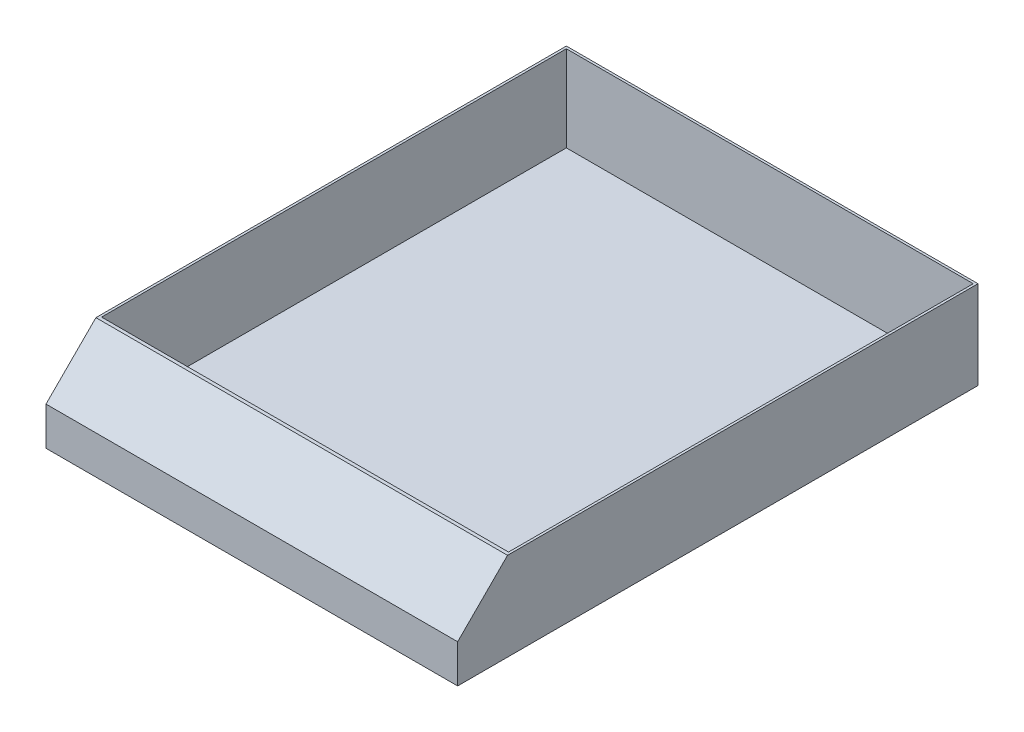
ISO-10303-21;
HEADER;
FILE_DESCRIPTION(('STEP AP214'),'2;1');
FILE_NAME('part.step','',(''),(''),'','','');
FILE_SCHEMA(('AUTOMOTIVE_DESIGN { 1 0 10303 214 1 1 1 1 }'));
ENDSEC;
DATA;
#1=APPLICATION_CONTEXT('core data for automotive mechanical design processes');
#2=APPLICATION_PROTOCOL_DEFINITION('international standard','automotive_design',2000,#1);
#3=PRODUCT_CONTEXT('',#1,'mechanical');
#4=PRODUCT('Part','Part','',(#3));
#5=PRODUCT_RELATED_PRODUCT_CATEGORY('part','',(#4));
#6=PRODUCT_DEFINITION_FORMATION('','',#4);
#7=PRODUCT_DEFINITION_CONTEXT('part definition',#1,'design');
#8=PRODUCT_DEFINITION('design','',#6,#7);
#9=PRODUCT_DEFINITION_SHAPE('','',#8);
#10=(LENGTH_UNIT() NAMED_UNIT(*) SI_UNIT(.MILLI.,.METRE.));
#11=(NAMED_UNIT(*) PLANE_ANGLE_UNIT() SI_UNIT($,.RADIAN.));
#12=(NAMED_UNIT(*) SI_UNIT($,.STERADIAN.) SOLID_ANGLE_UNIT());
#13=UNCERTAINTY_MEASURE_WITH_UNIT(LENGTH_MEASURE(1.E-05),#10,'distance_accuracy_value','');
#14=(GEOMETRIC_REPRESENTATION_CONTEXT(3) GLOBAL_UNCERTAINTY_ASSIGNED_CONTEXT((#13)) GLOBAL_UNIT_ASSIGNED_CONTEXT((#10,
#11,#12)) REPRESENTATION_CONTEXT('',''));
#15=CARTESIAN_POINT('',(0.,0.,0.));
#16=DIRECTION('',(0.,0.,1.));
#17=DIRECTION('',(1.,0.,0.));
#18=AXIS2_PLACEMENT_3D('',#15,#16,#17);
#19=CARTESIAN_POINT('',(700.,150.,-84.8528137423858));
#20=DIRECTION('',(0.,-1.,0.));
#21=DIRECTION('',(0.,0.,-1.));
#22=AXIS2_PLACEMENT_3D('',#19,#20,#21);
#23=PLANE('',#22);
#24=DIRECTION('',(0.,0.,1.));
#25=VECTOR('',#24,1.);
#26=CARTESIAN_POINT('',(0.,150.,-84.8528137423858));
#27=LINE('',#26,#25);
#28=CARTESIAN_POINT('',(0.,150.,-884.852813742386));
#29=VERTEX_POINT('',#28);
#30=CARTESIAN_POINT('',(0.,150.,-84.8528137423858));
#31=VERTEX_POINT('',#30);
#32=EDGE_CURVE('E115',#29,#31,#27,.T.);
#33=ORIENTED_EDGE('',*,*,#32,.T.);
#34=DIRECTION('',(-1.,0.,0.));
#35=VECTOR('',#34,1.);
#36=CARTESIAN_POINT('',(700.,150.,-84.8528137423858));
#37=LINE('',#36,#35);
#38=CARTESIAN_POINT('',(700.,150.,-84.8528137423858));
#39=VERTEX_POINT('',#38);
#40=EDGE_CURVE('E112',#39,#31,#37,.T.);
#41=ORIENTED_EDGE('',*,*,#40,.F.);
#42=DIRECTION('',(0.,0.,1.));
#43=VECTOR('',#42,1.);
#44=CARTESIAN_POINT('',(700.,150.,-84.8528137423858));
#45=LINE('',#44,#43);
#46=CARTESIAN_POINT('',(700.,150.,-884.852813742386));
#47=VERTEX_POINT('',#46);
#48=EDGE_CURVE('E102',#47,#39,#45,.T.);
#49=ORIENTED_EDGE('',*,*,#48,.F.);
#50=DIRECTION('',(-1.,0.,0.));
#51=VECTOR('',#50,1.);
#52=CARTESIAN_POINT('',(700.,150.,-884.852813742386));
#53=LINE('',#52,#51);
#54=EDGE_CURVE('E47',#47,#29,#53,.T.);
#55=ORIENTED_EDGE('',*,*,#54,.T.);
#56=EDGE_LOOP('',(#33,#41,#49,#55));
#57=FACE_BOUND('',#56,.T.);
#58=DIRECTION('',(0.,0.,1.));
#59=VECTOR('',#58,1.);
#60=CARTESIAN_POINT('',(4.,150.,0.));
#61=LINE('',#60,#59);
#62=CARTESIAN_POINT('',(4.,150.,-880.852813742386));
#63=VERTEX_POINT('',#62);
#64=CARTESIAN_POINT('',(4.,150.,-90.5096679918782));
#65=VERTEX_POINT('',#64);
#66=EDGE_CURVE('E155',#63,#65,#61,.T.);
#67=ORIENTED_EDGE('',*,*,#66,.F.);
#68=DIRECTION('',(-1.,0.,0.));
#69=VECTOR('',#68,1.);
#70=CARTESIAN_POINT('',(700.,150.,-880.852813742386));
#71=LINE('',#70,#69);
#72=CARTESIAN_POINT('',(696.,150.,-880.852813742386));
#73=VERTEX_POINT('',#72);
#74=EDGE_CURVE('E153',#73,#63,#71,.T.);
#75=ORIENTED_EDGE('',*,*,#74,.F.);
#76=DIRECTION('',(0.,0.,1.));
#77=VECTOR('',#76,1.);
#78=CARTESIAN_POINT('',(696.,150.,0.));
#79=LINE('',#78,#77);
#80=CARTESIAN_POINT('',(696.,150.,-90.5096679918782));
#81=VERTEX_POINT('',#80);
#82=EDGE_CURVE('E54',#73,#81,#79,.T.);
#83=ORIENTED_EDGE('',*,*,#82,.T.);
#84=DIRECTION('',(-1.,0.,0.));
#85=VECTOR('',#84,1.);
#86=CARTESIAN_POINT('',(700.,150.,-90.5096679918782));
#87=LINE('',#86,#85);
#88=EDGE_CURVE('E150',#81,#65,#87,.T.);
#89=ORIENTED_EDGE('',*,*,#88,.T.);
#90=EDGE_LOOP('',(#67,#75,#83,#89));
#91=FACE_BOUND('',#90,.T.);
#92=ADVANCED_FACE('F39',(#57,#91),#23,.F.);
#93=CARTESIAN_POINT('',(700.,1.09195334951539E-13,-884.852813742386));
#94=DIRECTION('',(0.,1.,0.));
#95=DIRECTION('',(0.,0.,1.));
#96=AXIS2_PLACEMENT_3D('',#93,#94,#95);
#97=PLANE('',#96);
#98=DIRECTION('',(0.,0.,-1.));
#99=VECTOR('',#98,1.);
#100=CARTESIAN_POINT('',(0.,1.09195334951539E-13,-884.852813742386));
#101=LINE('',#100,#99);
#102=CARTESIAN_POINT('',(0.,0.,0.));
#103=VERTEX_POINT('',#102);
#104=CARTESIAN_POINT('',(0.,1.09195334951539E-13,-884.852813742386));
#105=VERTEX_POINT('',#104);
#106=EDGE_CURVE('E126',#103,#105,#101,.T.);
#107=ORIENTED_EDGE('',*,*,#106,.T.);
#108=DIRECTION('',(-1.,0.,0.));
#109=VECTOR('',#108,1.);
#110=CARTESIAN_POINT('',(700.,1.09195334951539E-13,-884.852813742386));
#111=LINE('',#110,#109);
#112=CARTESIAN_POINT('',(700.,1.09195334951539E-13,-884.852813742386));
#113=VERTEX_POINT('',#112);
#114=EDGE_CURVE('E11',#113,#105,#111,.T.);
#115=ORIENTED_EDGE('',*,*,#114,.F.);
#116=DIRECTION('',(0.,0.,-1.));
#117=VECTOR('',#116,1.);
#118=CARTESIAN_POINT('',(700.,1.09195334951539E-13,-884.852813742386));
#119=LINE('',#118,#117);
#120=CARTESIAN_POINT('',(700.,0.,0.));
#121=VERTEX_POINT('',#120);
#122=EDGE_CURVE('E136',#121,#113,#119,.T.);
#123=ORIENTED_EDGE('',*,*,#122,.F.);
#124=DIRECTION('',(-1.,0.,0.));
#125=VECTOR('',#124,1.);
#126=CARTESIAN_POINT('',(700.,0.,0.));
#127=LINE('',#126,#125);
#128=EDGE_CURVE('E122',#121,#103,#127,.T.);
#129=ORIENTED_EDGE('',*,*,#128,.T.);
#130=EDGE_LOOP('',(#107,#115,#123,#129));
#131=FACE_BOUND('',#130,.T.);
#132=ADVANCED_FACE('F41',(#131),#97,.F.);
#133=CARTESIAN_POINT('',(700.,150.,-884.852813742386));
#134=DIRECTION('',(0.,0.,1.));
#135=DIRECTION('',(1.,0.,0.));
#136=AXIS2_PLACEMENT_3D('',#133,#134,#135);
#137=PLANE('',#136);
#138=DIRECTION('',(0.,1.,0.));
#139=VECTOR('',#138,1.);
#140=CARTESIAN_POINT('',(0.,150.,-884.852813742386));
#141=LINE('',#140,#139);
#142=EDGE_CURVE('E129',#105,#29,#141,.T.);
#143=ORIENTED_EDGE('',*,*,#142,.T.);
#144=ORIENTED_EDGE('',*,*,#54,.F.);
#145=DIRECTION('',(0.,1.,0.));
#146=VECTOR('',#145,1.);
#147=CARTESIAN_POINT('',(700.,150.,-884.852813742386));
#148=LINE('',#147,#146);
#149=EDGE_CURVE('E95',#113,#47,#148,.T.);
#150=ORIENTED_EDGE('',*,*,#149,.F.);
#151=ORIENTED_EDGE('',*,*,#114,.T.);
#152=EDGE_LOOP('',(#143,#144,#150,#151));
#153=FACE_BOUND('',#152,.T.);
#154=ADVANCED_FACE('F237',(#153),#137,.F.);
#155=CARTESIAN_POINT('',(700.,65.1471862576146,0.));
#156=DIRECTION('',(0.,-0.707106781186549,-0.707106781186546));
#157=DIRECTION('',(0.,0.707106781186546,-0.707106781186549));
#158=AXIS2_PLACEMENT_3D('',#155,#156,#157);
#159=PLANE('',#158);
#160=DIRECTION('',(0.,-0.707106781186546,0.707106781186549));
#161=VECTOR('',#160,1.);
#162=CARTESIAN_POINT('',(0.,65.1471862576146,0.));
#163=LINE('',#162,#161);
#164=CARTESIAN_POINT('',(0.,65.1471862576146,0.));
#165=VERTEX_POINT('',#164);
#166=EDGE_CURVE('E133',#31,#165,#163,.T.);
#167=ORIENTED_EDGE('',*,*,#166,.T.);
#168=DIRECTION('',(-1.,0.,0.));
#169=VECTOR('',#168,1.);
#170=CARTESIAN_POINT('',(700.,65.1471862576146,0.));
#171=LINE('',#170,#169);
#172=CARTESIAN_POINT('',(700.,65.1471862576146,0.));
#173=VERTEX_POINT('',#172);
#174=EDGE_CURVE('E118',#173,#165,#171,.T.);
#175=ORIENTED_EDGE('',*,*,#174,.F.);
#176=DIRECTION('',(0.,-0.707106781186546,0.707106781186549));
#177=VECTOR('',#176,1.);
#178=CARTESIAN_POINT('',(700.,65.1471862576146,0.));
#179=LINE('',#178,#177);
#180=EDGE_CURVE('E106',#39,#173,#179,.T.);
#181=ORIENTED_EDGE('',*,*,#180,.F.);
#182=ORIENTED_EDGE('',*,*,#40,.T.);
#183=EDGE_LOOP('',(#167,#175,#181,#182));
#184=FACE_BOUND('',#183,.T.);
#185=ADVANCED_FACE('F120',(#184),#159,.F.);
#186=CARTESIAN_POINT('',(700.,0.,0.));
#187=DIRECTION('',(0.,0.,-1.));
#188=DIRECTION('',(0.,1.,0.));
#189=AXIS2_PLACEMENT_3D('',#186,#187,#188);
#190=PLANE('',#189);
#191=DIRECTION('',(0.,-1.,0.));
#192=VECTOR('',#191,1.);
#193=CARTESIAN_POINT('',(0.,0.,0.));
#194=LINE('',#193,#192);
#195=EDGE_CURVE('E87',#165,#103,#194,.T.);
#196=ORIENTED_EDGE('',*,*,#195,.T.);
#197=ORIENTED_EDGE('',*,*,#128,.F.);
#198=DIRECTION('',(0.,-1.,0.));
#199=VECTOR('',#198,1.);
#200=CARTESIAN_POINT('',(700.,0.,0.));
#201=LINE('',#200,#199);
#202=EDGE_CURVE('E63',#173,#121,#201,.T.);
#203=ORIENTED_EDGE('',*,*,#202,.F.);
#204=ORIENTED_EDGE('',*,*,#174,.T.);
#205=EDGE_LOOP('',(#196,#197,#203,#204));
#206=FACE_BOUND('',#205,.T.);
#207=ADVANCED_FACE('F141',(#206),#190,.F.);
#208=CARTESIAN_POINT('',(700.,0.,0.));
#209=DIRECTION('',(-1.,0.,0.));
#210=DIRECTION('',(0.,0.,1.));
#211=AXIS2_PLACEMENT_3D('',#208,#209,#210);
#212=PLANE('',#211);
#213=ORIENTED_EDGE('',*,*,#122,.T.);
#214=ORIENTED_EDGE('',*,*,#149,.T.);
#215=ORIENTED_EDGE('',*,*,#48,.T.);
#216=ORIENTED_EDGE('',*,*,#180,.T.);
#217=ORIENTED_EDGE('',*,*,#202,.T.);
#218=EDGE_LOOP('',(#213,#214,#215,#216,#217));
#219=FACE_BOUND('',#218,.T.);
#220=ADVANCED_FACE('F104',(#219),#212,.F.);
#221=CARTESIAN_POINT('',(0.,0.,0.));
#222=DIRECTION('',(-1.,0.,0.));
#223=DIRECTION('',(0.,0.,1.));
#224=AXIS2_PLACEMENT_3D('',#221,#222,#223);
#225=PLANE('',#224);
#226=ORIENTED_EDGE('',*,*,#106,.F.);
#227=ORIENTED_EDGE('',*,*,#195,.F.);
#228=ORIENTED_EDGE('',*,*,#166,.F.);
#229=ORIENTED_EDGE('',*,*,#32,.F.);
#230=ORIENTED_EDGE('',*,*,#142,.F.);
#231=EDGE_LOOP('',(#226,#227,#228,#229,#230));
#232=FACE_BOUND('',#231,.T.);
#233=ADVANCED_FACE('F140',(#232),#225,.T.);
#234=CARTESIAN_POINT('',(700.,4.00000000000011,-884.852813742386));
#235=DIRECTION('',(0.,1.,0.));
#236=DIRECTION('',(0.,0.,1.));
#237=AXIS2_PLACEMENT_3D('',#234,#235,#236);
#238=PLANE('',#237);
#239=DIRECTION('',(0.,0.,-1.));
#240=VECTOR('',#239,1.);
#241=CARTESIAN_POINT('',(4.,4.,0.));
#242=LINE('',#241,#240);
#243=CARTESIAN_POINT('',(4.,4.,-4.));
#244=VERTEX_POINT('',#243);
#245=CARTESIAN_POINT('',(4.,4.00000000000011,-880.852813742386));
#246=VERTEX_POINT('',#245);
#247=EDGE_CURVE('E179',#244,#246,#242,.T.);
#248=ORIENTED_EDGE('',*,*,#247,.F.);
#249=DIRECTION('',(-1.,0.,0.));
#250=VECTOR('',#249,1.);
#251=CARTESIAN_POINT('',(700.,4.,-4.));
#252=LINE('',#251,#250);
#253=CARTESIAN_POINT('',(696.,4.,-4.));
#254=VERTEX_POINT('',#253);
#255=EDGE_CURVE('E168',#254,#244,#252,.T.);
#256=ORIENTED_EDGE('',*,*,#255,.F.);
#257=DIRECTION('',(0.,0.,-1.));
#258=VECTOR('',#257,1.);
#259=CARTESIAN_POINT('',(696.,4.,0.));
#260=LINE('',#259,#258);
#261=CARTESIAN_POINT('',(696.,4.00000000000011,-880.852813742386));
#262=VERTEX_POINT('',#261);
#263=EDGE_CURVE('E165',#254,#262,#260,.T.);
#264=ORIENTED_EDGE('',*,*,#263,.T.);
#265=DIRECTION('',(-1.,0.,0.));
#266=VECTOR('',#265,1.);
#267=CARTESIAN_POINT('',(700.,4.00000000000011,-880.852813742386));
#268=LINE('',#267,#266);
#269=EDGE_CURVE('E130',#262,#246,#268,.T.);
#270=ORIENTED_EDGE('',*,*,#269,.T.);
#271=EDGE_LOOP('',(#248,#256,#264,#270));
#272=FACE_BOUND('',#271,.T.);
#273=ADVANCED_FACE('F198',(#272),#238,.T.);
#274=CARTESIAN_POINT('',(700.,150.,-880.852813742386));
#275=DIRECTION('',(0.,0.,1.));
#276=DIRECTION('',(1.,0.,0.));
#277=AXIS2_PLACEMENT_3D('',#274,#275,#276);
#278=PLANE('',#277);
#279=DIRECTION('',(0.,1.,0.));
#280=VECTOR('',#279,1.);
#281=CARTESIAN_POINT('',(4.,0.,-880.852813742386));
#282=LINE('',#281,#280);
#283=EDGE_CURVE('E159',#246,#63,#282,.T.);
#284=ORIENTED_EDGE('',*,*,#283,.F.);
#285=ORIENTED_EDGE('',*,*,#269,.F.);
#286=DIRECTION('',(0.,1.,0.));
#287=VECTOR('',#286,1.);
#288=CARTESIAN_POINT('',(696.,0.,-880.852813742386));
#289=LINE('',#288,#287);
#290=EDGE_CURVE('E149',#262,#73,#289,.T.);
#291=ORIENTED_EDGE('',*,*,#290,.T.);
#292=ORIENTED_EDGE('',*,*,#74,.T.);
#293=EDGE_LOOP('',(#284,#285,#291,#292));
#294=FACE_BOUND('',#293,.T.);
#295=ADVANCED_FACE('F223',(#294),#278,.T.);
#296=CARTESIAN_POINT('',(700.,62.3187591328684,-2.82842712474616));
#297=DIRECTION('',(0.,-0.707106781186549,-0.707106781186546));
#298=DIRECTION('',(0.,0.707106781186546,-0.707106781186549));
#299=AXIS2_PLACEMENT_3D('',#296,#297,#298);
#300=PLANE('',#299);
#301=DIRECTION('',(0.,-0.707106781186546,0.707106781186549));
#302=VECTOR('',#301,1.);
#303=CARTESIAN_POINT('',(4.,29.7451660040612,29.7451660040611));
#304=LINE('',#303,#302);
#305=CARTESIAN_POINT('',(4.,63.4903320081222,-3.99999999999997));
#306=VERTEX_POINT('',#305);
#307=EDGE_CURVE('E158',#65,#306,#304,.T.);
#308=ORIENTED_EDGE('',*,*,#307,.F.);
#309=ORIENTED_EDGE('',*,*,#88,.F.);
#310=DIRECTION('',(0.,-0.707106781186546,0.707106781186549));
#311=VECTOR('',#310,1.);
#312=CARTESIAN_POINT('',(696.,29.7451660040612,29.7451660040611));
#313=LINE('',#312,#311);
#314=CARTESIAN_POINT('',(696.,63.4903320081222,-3.99999999999997));
#315=VERTEX_POINT('',#314);
#316=EDGE_CURVE('E148',#81,#315,#313,.T.);
#317=ORIENTED_EDGE('',*,*,#316,.T.);
#318=DIRECTION('',(-1.,0.,0.));
#319=VECTOR('',#318,1.);
#320=CARTESIAN_POINT('',(700.,63.4903320081222,-3.99999999999997));
#321=LINE('',#320,#319);
#322=EDGE_CURVE('E154',#315,#306,#321,.T.);
#323=ORIENTED_EDGE('',*,*,#322,.T.);
#324=EDGE_LOOP('',(#308,#309,#317,#323));
#325=FACE_BOUND('',#324,.T.);
#326=ADVANCED_FACE('F214',(#325),#300,.T.);
#327=CARTESIAN_POINT('',(700.,0.,-4.));
#328=DIRECTION('',(0.,0.,-1.));
#329=DIRECTION('',(0.,1.,0.));
#330=AXIS2_PLACEMENT_3D('',#327,#328,#329);
#331=PLANE('',#330);
#332=DIRECTION('',(0.,-1.,0.));
#333=VECTOR('',#332,1.);
#334=CARTESIAN_POINT('',(4.,0.,-4.));
#335=LINE('',#334,#333);
#336=EDGE_CURVE('E162',#306,#244,#335,.T.);
#337=ORIENTED_EDGE('',*,*,#336,.F.);
#338=ORIENTED_EDGE('',*,*,#322,.F.);
#339=DIRECTION('',(0.,-1.,0.));
#340=VECTOR('',#339,1.);
#341=CARTESIAN_POINT('',(696.,0.,-4.));
#342=LINE('',#341,#340);
#343=EDGE_CURVE('E171',#315,#254,#342,.T.);
#344=ORIENTED_EDGE('',*,*,#343,.T.);
#345=ORIENTED_EDGE('',*,*,#255,.T.);
#346=EDGE_LOOP('',(#337,#338,#344,#345));
#347=FACE_BOUND('',#346,.T.);
#348=ADVANCED_FACE('F220',(#347),#331,.T.);
#349=CARTESIAN_POINT('',(696.,0.,0.));
#350=DIRECTION('',(-1.,0.,0.));
#351=DIRECTION('',(0.,0.,1.));
#352=AXIS2_PLACEMENT_3D('',#349,#350,#351);
#353=PLANE('',#352);
#354=ORIENTED_EDGE('',*,*,#263,.F.);
#355=ORIENTED_EDGE('',*,*,#343,.F.);
#356=ORIENTED_EDGE('',*,*,#316,.F.);
#357=ORIENTED_EDGE('',*,*,#82,.F.);
#358=ORIENTED_EDGE('',*,*,#290,.F.);
#359=EDGE_LOOP('',(#354,#355,#356,#357,#358));
#360=FACE_BOUND('',#359,.T.);
#361=ADVANCED_FACE('F221',(#360),#353,.T.);
#362=CARTESIAN_POINT('',(4.,0.,0.));
#363=DIRECTION('',(-1.,0.,0.));
#364=DIRECTION('',(0.,0.,1.));
#365=AXIS2_PLACEMENT_3D('',#362,#363,#364);
#366=PLANE('',#365);
#367=ORIENTED_EDGE('',*,*,#247,.T.);
#368=ORIENTED_EDGE('',*,*,#283,.T.);
#369=ORIENTED_EDGE('',*,*,#66,.T.);
#370=ORIENTED_EDGE('',*,*,#307,.T.);
#371=ORIENTED_EDGE('',*,*,#336,.T.);
#372=EDGE_LOOP('',(#367,#368,#369,#370,#371));
#373=FACE_BOUND('',#372,.T.);
#374=ADVANCED_FACE('F190',(#373),#366,.F.);
#375=CLOSED_SHELL('',(#92,#132,#154,#185,#207,#220,#233,#273,#295,#326,#348,#361,#374));
#376=MANIFOLD_SOLID_BREP('B2',#375);
#377=ADVANCED_BREP_SHAPE_REPRESENTATION('',(#18,#376),#14);
#378=SHAPE_DEFINITION_REPRESENTATION(#9,#377);
ENDSEC;
END-ISO-10303-21;
